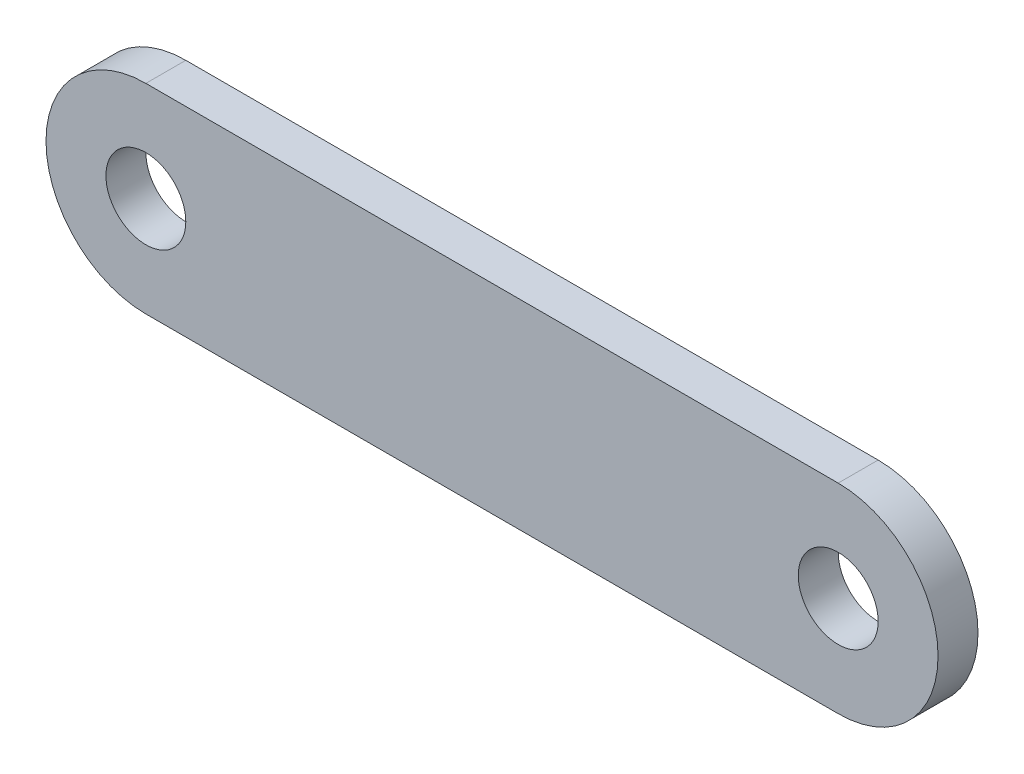
ISO-10303-21;
HEADER;
FILE_DESCRIPTION(('STEP AP214'),'2;1');
FILE_NAME('part.step','',(''),(''),'','','');
FILE_SCHEMA(('AUTOMOTIVE_DESIGN { 1 0 10303 214 1 1 1 1 }'));
ENDSEC;
DATA;
#1=APPLICATION_CONTEXT('core data for automotive mechanical design processes');
#2=APPLICATION_PROTOCOL_DEFINITION('international standard','automotive_design',2000,#1);
#3=PRODUCT_CONTEXT('',#1,'mechanical');
#4=PRODUCT('Part','Part','',(#3));
#5=PRODUCT_RELATED_PRODUCT_CATEGORY('part','',(#4));
#6=PRODUCT_DEFINITION_FORMATION('','',#4);
#7=PRODUCT_DEFINITION_CONTEXT('part definition',#1,'design');
#8=PRODUCT_DEFINITION('design','',#6,#7);
#9=PRODUCT_DEFINITION_SHAPE('','',#8);
#10=(LENGTH_UNIT() NAMED_UNIT(*) SI_UNIT(.MILLI.,.METRE.));
#11=(NAMED_UNIT(*) PLANE_ANGLE_UNIT() SI_UNIT($,.RADIAN.));
#12=(NAMED_UNIT(*) SI_UNIT($,.STERADIAN.) SOLID_ANGLE_UNIT());
#13=UNCERTAINTY_MEASURE_WITH_UNIT(LENGTH_MEASURE(1.E-05),#10,'distance_accuracy_value','');
#14=(GEOMETRIC_REPRESENTATION_CONTEXT(3) GLOBAL_UNCERTAINTY_ASSIGNED_CONTEXT((#13)) GLOBAL_UNIT_ASSIGNED_CONTEXT((#10,
#11,#12)) REPRESENTATION_CONTEXT('',''));
#15=CARTESIAN_POINT('',(0.,0.,0.));
#16=DIRECTION('',(0.,0.,1.));
#17=DIRECTION('',(1.,0.,0.));
#18=AXIS2_PLACEMENT_3D('',#15,#16,#17);
#19=CARTESIAN_POINT('',(0.,0.,1.5));
#20=DIRECTION('',(0.,0.,1.));
#21=DIRECTION('',(1.,0.,0.));
#22=AXIS2_PLACEMENT_3D('',#19,#20,#21);
#23=PLANE('',#22);
#24=CARTESIAN_POINT('',(0.,0.,1.5));
#25=DIRECTION('',(0.,0.,1.));
#26=DIRECTION('',(1.,0.,0.));
#27=AXIS2_PLACEMENT_3D('',#24,#25,#26);
#28=CIRCLE('',#27,1.5);
#29=CARTESIAN_POINT('',(1.5,0.,1.5));
#30=VERTEX_POINT('',#29);
#31=EDGE_CURVE('E100',#30,#30,#28,.T.);
#32=ORIENTED_EDGE('',*,*,#31,.F.);
#33=EDGE_LOOP('',(#32));
#34=FACE_BOUND('',#33,.T.);
#35=CARTESIAN_POINT('',(0.,0.,1.5));
#36=DIRECTION('',(0.,0.,1.));
#37=DIRECTION('',(1.,0.,0.));
#38=AXIS2_PLACEMENT_3D('',#35,#36,#37);
#39=CIRCLE('',#38,3.75);
#40=CARTESIAN_POINT('',(0.,3.75,1.5));
#41=VERTEX_POINT('',#40);
#42=CARTESIAN_POINT('',(0.,-3.75,1.5));
#43=VERTEX_POINT('',#42);
#44=EDGE_CURVE('E85',#41,#43,#39,.T.);
#45=ORIENTED_EDGE('',*,*,#44,.T.);
#46=DIRECTION('',(1.,0.,0.));
#47=VECTOR('',#46,1.);
#48=CARTESIAN_POINT('',(0.,-3.75,1.5));
#49=LINE('',#48,#47);
#50=CARTESIAN_POINT('',(26.,-3.75,1.5));
#51=VERTEX_POINT('',#50);
#52=EDGE_CURVE('E80',#43,#51,#49,.T.);
#53=ORIENTED_EDGE('',*,*,#52,.T.);
#54=CARTESIAN_POINT('',(26.,0.,1.5));
#55=DIRECTION('',(0.,0.,1.));
#56=DIRECTION('',(1.,0.,0.));
#57=AXIS2_PLACEMENT_3D('',#54,#55,#56);
#58=CIRCLE('',#57,3.75);
#59=CARTESIAN_POINT('',(26.,3.75,1.5));
#60=VERTEX_POINT('',#59);
#61=EDGE_CURVE('E83',#51,#60,#58,.T.);
#62=ORIENTED_EDGE('',*,*,#61,.T.);
#63=DIRECTION('',(-1.,0.,0.));
#64=VECTOR('',#63,1.);
#65=CARTESIAN_POINT('',(0.,3.75,1.5));
#66=LINE('',#65,#64);
#67=EDGE_CURVE('E50',#60,#41,#66,.T.);
#68=ORIENTED_EDGE('',*,*,#67,.T.);
#69=EDGE_LOOP('',(#45,#53,#62,#68));
#70=FACE_BOUND('',#69,.T.);
#71=CARTESIAN_POINT('',(26.,0.,1.5));
#72=DIRECTION('',(0.,0.,1.));
#73=DIRECTION('',(1.,0.,0.));
#74=AXIS2_PLACEMENT_3D('',#71,#72,#73);
#75=CIRCLE('',#74,1.5);
#76=CARTESIAN_POINT('',(27.5,0.,1.5));
#77=VERTEX_POINT('',#76);
#78=EDGE_CURVE('E115',#77,#77,#75,.T.);
#79=ORIENTED_EDGE('',*,*,#78,.F.);
#80=EDGE_LOOP('',(#79));
#81=FACE_BOUND('',#80,.T.);
#82=ADVANCED_FACE('F33',(#34,#70,#81),#23,.T.);
#83=CARTESIAN_POINT('',(0.,0.,0.));
#84=DIRECTION('',(0.,0.,1.));
#85=DIRECTION('',(1.,0.,0.));
#86=AXIS2_PLACEMENT_3D('',#83,#84,#85);
#87=PLANE('',#86);
#88=CARTESIAN_POINT('',(0.,0.,0.));
#89=DIRECTION('',(0.,0.,1.));
#90=DIRECTION('',(1.,0.,0.));
#91=AXIS2_PLACEMENT_3D('',#88,#89,#90);
#92=CIRCLE('',#91,1.5);
#93=CARTESIAN_POINT('',(1.5,0.,0.));
#94=VERTEX_POINT('',#93);
#95=EDGE_CURVE('E112',#94,#94,#92,.T.);
#96=ORIENTED_EDGE('',*,*,#95,.T.);
#97=EDGE_LOOP('',(#96));
#98=FACE_BOUND('',#97,.T.);
#99=CARTESIAN_POINT('',(0.,0.,0.));
#100=DIRECTION('',(0.,0.,1.));
#101=DIRECTION('',(1.,0.,0.));
#102=AXIS2_PLACEMENT_3D('',#99,#100,#101);
#103=CIRCLE('',#102,3.75);
#104=CARTESIAN_POINT('',(0.,3.75,0.));
#105=VERTEX_POINT('',#104);
#106=CARTESIAN_POINT('',(0.,-3.75,0.));
#107=VERTEX_POINT('',#106);
#108=EDGE_CURVE('E97',#105,#107,#103,.T.);
#109=ORIENTED_EDGE('',*,*,#108,.F.);
#110=DIRECTION('',(-1.,0.,0.));
#111=VECTOR('',#110,1.);
#112=CARTESIAN_POINT('',(0.,3.75,0.));
#113=LINE('',#112,#111);
#114=CARTESIAN_POINT('',(26.,3.75,0.));
#115=VERTEX_POINT('',#114);
#116=EDGE_CURVE('E73',#115,#105,#113,.T.);
#117=ORIENTED_EDGE('',*,*,#116,.F.);
#118=CARTESIAN_POINT('',(26.,0.,0.));
#119=DIRECTION('',(0.,0.,1.));
#120=DIRECTION('',(1.,0.,0.));
#121=AXIS2_PLACEMENT_3D('',#118,#119,#120);
#122=CIRCLE('',#121,3.75);
#123=CARTESIAN_POINT('',(26.,-3.75,0.));
#124=VERTEX_POINT('',#123);
#125=EDGE_CURVE('E67',#124,#115,#122,.T.);
#126=ORIENTED_EDGE('',*,*,#125,.F.);
#127=DIRECTION('',(1.,0.,0.));
#128=VECTOR('',#127,1.);
#129=CARTESIAN_POINT('',(0.,-3.75,0.));
#130=LINE('',#129,#128);
#131=EDGE_CURVE('E89',#107,#124,#130,.T.);
#132=ORIENTED_EDGE('',*,*,#131,.F.);
#133=EDGE_LOOP('',(#109,#117,#126,#132));
#134=FACE_BOUND('',#133,.T.);
#135=CARTESIAN_POINT('',(26.,0.,0.));
#136=DIRECTION('',(0.,0.,1.));
#137=DIRECTION('',(1.,0.,0.));
#138=AXIS2_PLACEMENT_3D('',#135,#136,#137);
#139=CIRCLE('',#138,1.5);
#140=CARTESIAN_POINT('',(27.5,0.,0.));
#141=VERTEX_POINT('',#140);
#142=EDGE_CURVE('E118',#141,#141,#139,.T.);
#143=ORIENTED_EDGE('',*,*,#142,.T.);
#144=EDGE_LOOP('',(#143));
#145=FACE_BOUND('',#144,.T.);
#146=ADVANCED_FACE('F108',(#98,#134,#145),#87,.F.);
#147=CARTESIAN_POINT('',(0.,0.,1.5));
#148=DIRECTION('',(0.,0.,-1.));
#149=DIRECTION('',(-1.,0.,0.));
#150=AXIS2_PLACEMENT_3D('',#147,#148,#149);
#151=CYLINDRICAL_SURFACE('',#150,3.75);
#152=ORIENTED_EDGE('',*,*,#108,.T.);
#153=DIRECTION('',(0.,0.,-1.));
#154=VECTOR('',#153,1.);
#155=CARTESIAN_POINT('',(0.,-3.75,1.5));
#156=LINE('',#155,#154);
#157=EDGE_CURVE('E11',#43,#107,#156,.T.);
#158=ORIENTED_EDGE('',*,*,#157,.F.);
#159=ORIENTED_EDGE('',*,*,#44,.F.);
#160=DIRECTION('',(0.,0.,-1.));
#161=VECTOR('',#160,1.);
#162=CARTESIAN_POINT('',(0.,3.75,1.5));
#163=LINE('',#162,#161);
#164=EDGE_CURVE('E93',#41,#105,#163,.T.);
#165=ORIENTED_EDGE('',*,*,#164,.T.);
#166=EDGE_LOOP('',(#152,#158,#159,#165));
#167=FACE_BOUND('',#166,.T.);
#168=ADVANCED_FACE('F35',(#167),#151,.T.);
#169=CARTESIAN_POINT('',(0.,-3.75,1.5));
#170=DIRECTION('',(0.,1.,0.));
#171=DIRECTION('',(-1.,0.,0.));
#172=AXIS2_PLACEMENT_3D('',#169,#170,#171);
#173=PLANE('',#172);
#174=ORIENTED_EDGE('',*,*,#131,.T.);
#175=DIRECTION('',(0.,0.,-1.));
#176=VECTOR('',#175,1.);
#177=CARTESIAN_POINT('',(26.,-3.75,1.5));
#178=LINE('',#177,#176);
#179=EDGE_CURVE('E42',#51,#124,#178,.T.);
#180=ORIENTED_EDGE('',*,*,#179,.F.);
#181=ORIENTED_EDGE('',*,*,#52,.F.);
#182=ORIENTED_EDGE('',*,*,#157,.T.);
#183=EDGE_LOOP('',(#174,#180,#181,#182));
#184=FACE_BOUND('',#183,.T.);
#185=ADVANCED_FACE('F88',(#184),#173,.F.);
#186=CARTESIAN_POINT('',(26.,0.,1.5));
#187=DIRECTION('',(0.,0.,-1.));
#188=DIRECTION('',(-1.,0.,0.));
#189=AXIS2_PLACEMENT_3D('',#186,#187,#188);
#190=CYLINDRICAL_SURFACE('',#189,3.75);
#191=ORIENTED_EDGE('',*,*,#125,.T.);
#192=DIRECTION('',(0.,0.,-1.));
#193=VECTOR('',#192,1.);
#194=CARTESIAN_POINT('',(26.,3.75,1.5));
#195=LINE('',#194,#193);
#196=EDGE_CURVE('E90',#60,#115,#195,.T.);
#197=ORIENTED_EDGE('',*,*,#196,.F.);
#198=ORIENTED_EDGE('',*,*,#61,.F.);
#199=ORIENTED_EDGE('',*,*,#179,.T.);
#200=EDGE_LOOP('',(#191,#197,#198,#199));
#201=FACE_BOUND('',#200,.T.);
#202=ADVANCED_FACE('F91',(#201),#190,.T.);
#203=CARTESIAN_POINT('',(0.,3.75,1.5));
#204=DIRECTION('',(0.,-1.,0.));
#205=DIRECTION('',(1.,0.,0.));
#206=AXIS2_PLACEMENT_3D('',#203,#204,#205);
#207=PLANE('',#206);
#208=ORIENTED_EDGE('',*,*,#116,.T.);
#209=ORIENTED_EDGE('',*,*,#164,.F.);
#210=ORIENTED_EDGE('',*,*,#67,.F.);
#211=ORIENTED_EDGE('',*,*,#196,.T.);
#212=EDGE_LOOP('',(#208,#209,#210,#211));
#213=FACE_BOUND('',#212,.T.);
#214=ADVANCED_FACE('F105',(#213),#207,.F.);
#215=CARTESIAN_POINT('',(0.,0.,1.5));
#216=DIRECTION('',(0.,0.,-1.));
#217=DIRECTION('',(-1.,0.,0.));
#218=AXIS2_PLACEMENT_3D('',#215,#216,#217);
#219=CYLINDRICAL_SURFACE('',#218,1.5);
#220=ORIENTED_EDGE('',*,*,#31,.T.);
#221=EDGE_LOOP('',(#220));
#222=FACE_BOUND('',#221,.T.);
#223=ORIENTED_EDGE('',*,*,#95,.F.);
#224=EDGE_LOOP('',(#223));
#225=FACE_BOUND('',#224,.T.);
#226=ADVANCED_FACE('F136',(#222,#225),#219,.F.);
#227=CARTESIAN_POINT('',(26.,0.,1.5));
#228=DIRECTION('',(0.,0.,-1.));
#229=DIRECTION('',(-1.,0.,0.));
#230=AXIS2_PLACEMENT_3D('',#227,#228,#229);
#231=CYLINDRICAL_SURFACE('',#230,1.5);
#232=ORIENTED_EDGE('',*,*,#78,.T.);
#233=EDGE_LOOP('',(#232));
#234=FACE_BOUND('',#233,.T.);
#235=ORIENTED_EDGE('',*,*,#142,.F.);
#236=EDGE_LOOP('',(#235));
#237=FACE_BOUND('',#236,.T.);
#238=ADVANCED_FACE('F124',(#234,#237),#231,.F.);
#239=CLOSED_SHELL('',(#82,#146,#168,#185,#202,#214,#226,#238));
#240=MANIFOLD_SOLID_BREP('B2',#239);
#241=ADVANCED_BREP_SHAPE_REPRESENTATION('',(#18,#240),#14);
#242=SHAPE_DEFINITION_REPRESENTATION(#9,#241);
ENDSEC;
END-ISO-10303-21;
